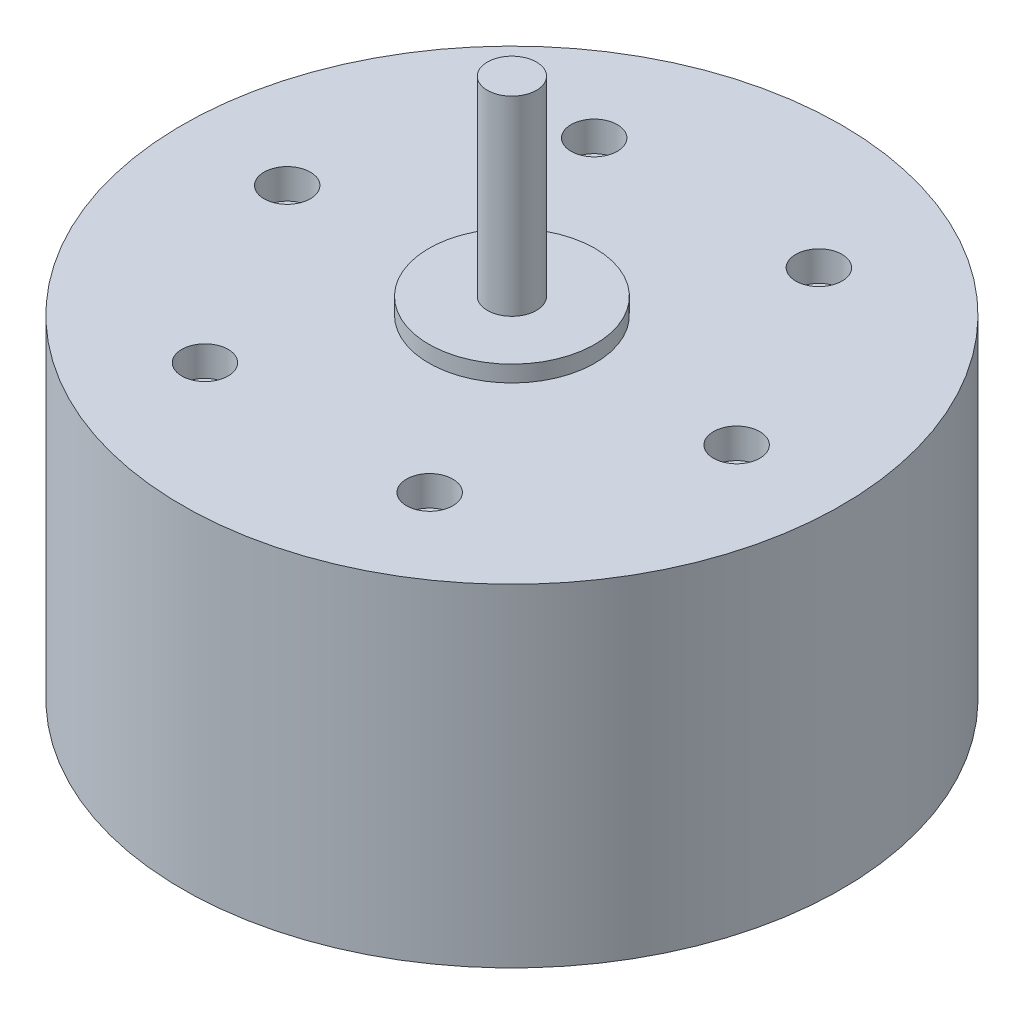
ISO-10303-21;
HEADER;
FILE_DESCRIPTION(('STEP AP214'),'2;1');
FILE_NAME('part.step','',(''),(''),'','','');
FILE_SCHEMA(('AUTOMOTIVE_DESIGN { 1 0 10303 214 1 1 1 1 }'));
ENDSEC;
DATA;
#1=APPLICATION_CONTEXT('core data for automotive mechanical design processes');
#2=APPLICATION_PROTOCOL_DEFINITION('international standard','automotive_design',2000,#1);
#3=PRODUCT_CONTEXT('',#1,'mechanical');
#4=PRODUCT('Part','Part','',(#3));
#5=PRODUCT_RELATED_PRODUCT_CATEGORY('part','',(#4));
#6=PRODUCT_DEFINITION_FORMATION('','',#4);
#7=PRODUCT_DEFINITION_CONTEXT('part definition',#1,'design');
#8=PRODUCT_DEFINITION('design','',#6,#7);
#9=PRODUCT_DEFINITION_SHAPE('','',#8);
#10=(LENGTH_UNIT() NAMED_UNIT(*) SI_UNIT(.MILLI.,.METRE.));
#11=(NAMED_UNIT(*) PLANE_ANGLE_UNIT() SI_UNIT($,.RADIAN.));
#12=(NAMED_UNIT(*) SI_UNIT($,.STERADIAN.) SOLID_ANGLE_UNIT());
#13=UNCERTAINTY_MEASURE_WITH_UNIT(LENGTH_MEASURE(1.E-05),#10,'distance_accuracy_value','');
#14=(GEOMETRIC_REPRESENTATION_CONTEXT(3) GLOBAL_UNCERTAINTY_ASSIGNED_CONTEXT((#13)) GLOBAL_UNIT_ASSIGNED_CONTEXT((#10,
#11,#12)) REPRESENTATION_CONTEXT('',''));
#15=CARTESIAN_POINT('',(0.,0.,0.));
#16=DIRECTION('',(0.,0.,1.));
#17=DIRECTION('',(1.,0.,0.));
#18=AXIS2_PLACEMENT_3D('',#15,#16,#17);
#19=CARTESIAN_POINT('',(2.85,-10.15,0.));
#20=DIRECTION('',(0.,-1.,0.));
#21=DIRECTION('',(0.,0.,-1.));
#22=AXIS2_PLACEMENT_3D('',#19,#20,#21);
#23=PLANE('',#22);
#24=CARTESIAN_POINT('',(0.,-10.15,0.));
#25=DIRECTION('',(0.,-1.,0.));
#26=DIRECTION('',(0.,0.,-1.));
#27=AXIS2_PLACEMENT_3D('',#24,#25,#26);
#28=CIRCLE('',#27,2.85);
#29=CARTESIAN_POINT('',(0.,-10.15,-2.85));
#30=VERTEX_POINT('',#29);
#31=EDGE_CURVE('E79',#30,#30,#28,.T.);
#32=ORIENTED_EDGE('',*,*,#31,.T.);
#33=EDGE_LOOP('',(#32));
#34=FACE_BOUND('',#33,.T.);
#35=ADVANCED_FACE('F36',(#34),#23,.T.);
#36=CARTESIAN_POINT('',(0.,10.15,0.));
#37=DIRECTION('',(0.,1.,0.));
#38=DIRECTION('',(0.,0.,1.));
#39=AXIS2_PLACEMENT_3D('',#36,#37,#38);
#40=PLANE('',#39);
#41=CARTESIAN_POINT('',(0.,10.15,0.));
#42=DIRECTION('',(0.,-1.,0.));
#43=DIRECTION('',(0.,0.,-1.));
#44=AXIS2_PLACEMENT_3D('',#41,#42,#43);
#45=CIRCLE('',#44,0.899999999999997);
#46=CARTESIAN_POINT('',(0.,10.15,-0.899999999999997));
#47=VERTEX_POINT('',#46);
#48=EDGE_CURVE('E10',#47,#47,#45,.T.);
#49=ORIENTED_EDGE('',*,*,#48,.F.);
#50=EDGE_LOOP('',(#49));
#51=FACE_BOUND('',#50,.T.);
#52=ADVANCED_FACE('F192',(#51),#40,.T.);
#53=CARTESIAN_POINT('',(0.,-11.8431818181818,0.));
#54=DIRECTION('',(0.,-1.,0.));
#55=DIRECTION('',(0.,0.,-1.));
#56=AXIS2_PLACEMENT_3D('',#53,#54,#55);
#57=CYLINDRICAL_SURFACE('',#56,0.899999999999998);
#58=ORIENTED_EDGE('',*,*,#48,.T.);
#59=EDGE_LOOP('',(#58));
#60=FACE_BOUND('',#59,.T.);
#61=CARTESIAN_POINT('',(0.,3.15,0.));
#62=DIRECTION('',(0.,-1.,0.));
#63=DIRECTION('',(0.,0.,-1.));
#64=AXIS2_PLACEMENT_3D('',#61,#62,#63);
#65=CIRCLE('',#64,0.899999999999998);
#66=CARTESIAN_POINT('',(0.,3.15,-0.899999999999998));
#67=VERTEX_POINT('',#66);
#68=EDGE_CURVE('E43',#67,#67,#65,.T.);
#69=ORIENTED_EDGE('',*,*,#68,.F.);
#70=EDGE_LOOP('',(#69));
#71=FACE_BOUND('',#70,.T.);
#72=ADVANCED_FACE('F196',(#60,#71),#57,.T.);
#73=CARTESIAN_POINT('',(0.899999999999998,3.15,0.));
#74=DIRECTION('',(0.,1.,0.));
#75=DIRECTION('',(0.,0.,1.));
#76=AXIS2_PLACEMENT_3D('',#73,#74,#75);
#77=PLANE('',#76);
#78=ORIENTED_EDGE('',*,*,#68,.T.);
#79=EDGE_LOOP('',(#78));
#80=FACE_BOUND('',#79,.T.);
#81=CARTESIAN_POINT('',(0.,3.15,0.));
#82=DIRECTION('',(0.,-1.,0.));
#83=DIRECTION('',(0.,0.,-1.));
#84=AXIS2_PLACEMENT_3D('',#81,#82,#83);
#85=CIRCLE('',#84,3.05);
#86=CARTESIAN_POINT('',(0.,3.15,-3.05));
#87=VERTEX_POINT('',#86);
#88=EDGE_CURVE('E48',#87,#87,#85,.T.);
#89=ORIENTED_EDGE('',*,*,#88,.F.);
#90=EDGE_LOOP('',(#89));
#91=FACE_BOUND('',#90,.T.);
#92=ADVANCED_FACE('F201',(#80,#91),#77,.T.);
#93=CARTESIAN_POINT('',(0.,-11.8431818181818,0.));
#94=DIRECTION('',(0.,-1.,0.));
#95=DIRECTION('',(0.,0.,-1.));
#96=AXIS2_PLACEMENT_3D('',#93,#94,#95);
#97=CYLINDRICAL_SURFACE('',#96,3.05);
#98=ORIENTED_EDGE('',*,*,#88,.T.);
#99=EDGE_LOOP('',(#98));
#100=FACE_BOUND('',#99,.T.);
#101=CARTESIAN_POINT('',(0.,2.55,0.));
#102=DIRECTION('',(0.,-1.,0.));
#103=DIRECTION('',(0.,0.,-1.));
#104=AXIS2_PLACEMENT_3D('',#101,#102,#103);
#105=CIRCLE('',#104,3.05);
#106=CARTESIAN_POINT('',(0.,2.55,-3.05));
#107=VERTEX_POINT('',#106);
#108=EDGE_CURVE('E53',#107,#107,#105,.T.);
#109=ORIENTED_EDGE('',*,*,#108,.F.);
#110=EDGE_LOOP('',(#109));
#111=FACE_BOUND('',#110,.T.);
#112=ADVANCED_FACE('F145',(#100,#111),#97,.T.);
#113=CARTESIAN_POINT('',(3.05,2.55,0.));
#114=DIRECTION('',(0.,1.,0.));
#115=DIRECTION('',(0.,0.,1.));
#116=AXIS2_PLACEMENT_3D('',#113,#114,#115);
#117=PLANE('',#116);
#118=CARTESIAN_POINT('',(-8.25,2.55,0.));
#119=DIRECTION('',(0.,1.,0.));
#120=DIRECTION('',(0.,0.,1.));
#121=AXIS2_PLACEMENT_3D('',#118,#119,#120);
#122=CIRCLE('',#121,0.85);
#123=CARTESIAN_POINT('',(-8.25,2.55,0.85));
#124=VERTEX_POINT('',#123);
#125=EDGE_CURVE('E117',#124,#124,#122,.T.);
#126=ORIENTED_EDGE('',*,*,#125,.F.);
#127=EDGE_LOOP('',(#126));
#128=FACE_BOUND('',#127,.T.);
#129=CARTESIAN_POINT('',(-4.12499999999999,2.55,7.14470958122162));
#130=DIRECTION('',(0.,1.,0.));
#131=DIRECTION('',(0.,0.,1.));
#132=AXIS2_PLACEMENT_3D('',#129,#130,#131);
#133=CIRCLE('',#132,0.85);
#134=CARTESIAN_POINT('',(-4.12499999999999,2.55,7.99470958122162));
#135=VERTEX_POINT('',#134);
#136=EDGE_CURVE('E118',#135,#135,#133,.T.);
#137=ORIENTED_EDGE('',*,*,#136,.F.);
#138=EDGE_LOOP('',(#137));
#139=FACE_BOUND('',#138,.T.);
#140=CARTESIAN_POINT('',(4.125,2.55,7.14470958122162));
#141=DIRECTION('',(0.,1.,0.));
#142=DIRECTION('',(0.,0.,1.));
#143=AXIS2_PLACEMENT_3D('',#140,#141,#142);
#144=CIRCLE('',#143,0.85);
#145=CARTESIAN_POINT('',(4.125,2.55,7.99470958122162));
#146=VERTEX_POINT('',#145);
#147=EDGE_CURVE('E84',#146,#146,#144,.T.);
#148=ORIENTED_EDGE('',*,*,#147,.F.);
#149=EDGE_LOOP('',(#148));
#150=FACE_BOUND('',#149,.T.);
#151=CARTESIAN_POINT('',(8.25,2.55,0.));
#152=DIRECTION('',(0.,1.,0.));
#153=DIRECTION('',(0.,0.,1.));
#154=AXIS2_PLACEMENT_3D('',#151,#152,#153);
#155=CIRCLE('',#154,0.85);
#156=CARTESIAN_POINT('',(8.25,2.55,0.85));
#157=VERTEX_POINT('',#156);
#158=EDGE_CURVE('E93',#157,#157,#155,.T.);
#159=ORIENTED_EDGE('',*,*,#158,.F.);
#160=EDGE_LOOP('',(#159));
#161=FACE_BOUND('',#160,.T.);
#162=CARTESIAN_POINT('',(4.125,2.55,-7.14470958122162));
#163=DIRECTION('',(0.,1.,0.));
#164=DIRECTION('',(0.,0.,1.));
#165=AXIS2_PLACEMENT_3D('',#162,#163,#164);
#166=CIRCLE('',#165,0.85);
#167=CARTESIAN_POINT('',(4.125,2.55,-6.29470958122162));
#168=VERTEX_POINT('',#167);
#169=EDGE_CURVE('E101',#168,#168,#166,.T.);
#170=ORIENTED_EDGE('',*,*,#169,.F.);
#171=EDGE_LOOP('',(#170));
#172=FACE_BOUND('',#171,.T.);
#173=CARTESIAN_POINT('',(-4.125,2.55,-7.14470958122162));
#174=DIRECTION('',(0.,1.,0.));
#175=DIRECTION('',(0.,0.,1.));
#176=AXIS2_PLACEMENT_3D('',#173,#174,#175);
#177=CIRCLE('',#176,0.85);
#178=CARTESIAN_POINT('',(-4.125,2.55,-6.29470958122162));
#179=VERTEX_POINT('',#178);
#180=EDGE_CURVE('E109',#179,#179,#177,.T.);
#181=ORIENTED_EDGE('',*,*,#180,.F.);
#182=EDGE_LOOP('',(#181));
#183=FACE_BOUND('',#182,.T.);
#184=ORIENTED_EDGE('',*,*,#108,.T.);
#185=EDGE_LOOP('',(#184));
#186=FACE_BOUND('',#185,.T.);
#187=CARTESIAN_POINT('',(0.,2.55,0.));
#188=DIRECTION('',(0.,-1.,0.));
#189=DIRECTION('',(0.,0.,-1.));
#190=AXIS2_PLACEMENT_3D('',#187,#188,#189);
#191=CIRCLE('',#190,12.1);
#192=CARTESIAN_POINT('',(0.,2.55,-12.1));
#193=VERTEX_POINT('',#192);
#194=EDGE_CURVE('E59',#193,#193,#191,.T.);
#195=ORIENTED_EDGE('',*,*,#194,.F.);
#196=EDGE_LOOP('',(#195));
#197=FACE_BOUND('',#196,.T.);
#198=ADVANCED_FACE('F141',(#128,#139,#150,#161,#172,#183,#186,#197),#117,.T.);
#199=CARTESIAN_POINT('',(0.,-11.8431818181818,0.));
#200=DIRECTION('',(0.,-1.,0.));
#201=DIRECTION('',(0.,0.,-1.));
#202=AXIS2_PLACEMENT_3D('',#199,#200,#201);
#203=CYLINDRICAL_SURFACE('',#202,12.1);
#204=ORIENTED_EDGE('',*,*,#194,.T.);
#205=EDGE_LOOP('',(#204));
#206=FACE_BOUND('',#205,.T.);
#207=CARTESIAN_POINT('',(0.,-9.65,0.));
#208=DIRECTION('',(0.,-1.,0.));
#209=DIRECTION('',(0.,0.,-1.));
#210=AXIS2_PLACEMENT_3D('',#207,#208,#209);
#211=CIRCLE('',#210,12.1);
#212=CARTESIAN_POINT('',(0.,-9.65,-12.1));
#213=VERTEX_POINT('',#212);
#214=EDGE_CURVE('E63',#213,#213,#211,.T.);
#215=ORIENTED_EDGE('',*,*,#214,.F.);
#216=EDGE_LOOP('',(#215));
#217=FACE_BOUND('',#216,.T.);
#218=ADVANCED_FACE('F144',(#206,#217),#203,.T.);
#219=CARTESIAN_POINT('',(12.1,-9.65,0.));
#220=DIRECTION('',(0.,-1.,0.));
#221=DIRECTION('',(0.,0.,-1.));
#222=AXIS2_PLACEMENT_3D('',#219,#220,#221);
#223=PLANE('',#222);
#224=ORIENTED_EDGE('',*,*,#214,.T.);
#225=EDGE_LOOP('',(#224));
#226=FACE_BOUND('',#225,.T.);
#227=CARTESIAN_POINT('',(0.,-9.65,0.));
#228=DIRECTION('',(0.,-1.,0.));
#229=DIRECTION('',(0.,0.,-1.));
#230=AXIS2_PLACEMENT_3D('',#227,#228,#229);
#231=CIRCLE('',#230,11.9);
#232=CARTESIAN_POINT('',(0.,-9.65,-11.9));
#233=VERTEX_POINT('',#232);
#234=EDGE_CURVE('E67',#233,#233,#231,.T.);
#235=ORIENTED_EDGE('',*,*,#234,.F.);
#236=EDGE_LOOP('',(#235));
#237=FACE_BOUND('',#236,.T.);
#238=ADVANCED_FACE('F163',(#226,#237),#223,.T.);
#239=CARTESIAN_POINT('',(0.,-11.8431818181818,0.));
#240=DIRECTION('',(0.,-1.,0.));
#241=DIRECTION('',(0.,0.,-1.));
#242=AXIS2_PLACEMENT_3D('',#239,#240,#241);
#243=CYLINDRICAL_SURFACE('',#242,11.9);
#244=ORIENTED_EDGE('',*,*,#234,.T.);
#245=EDGE_LOOP('',(#244));
#246=FACE_BOUND('',#245,.T.);
#247=CARTESIAN_POINT('',(0.,-9.05,0.));
#248=DIRECTION('',(0.,-1.,0.));
#249=DIRECTION('',(0.,0.,-1.));
#250=AXIS2_PLACEMENT_3D('',#247,#248,#249);
#251=CIRCLE('',#250,11.9);
#252=CARTESIAN_POINT('',(0.,-9.05,-11.9));
#253=VERTEX_POINT('',#252);
#254=EDGE_CURVE('E71',#253,#253,#251,.T.);
#255=ORIENTED_EDGE('',*,*,#254,.F.);
#256=EDGE_LOOP('',(#255));
#257=FACE_BOUND('',#256,.T.);
#258=ADVANCED_FACE('F169',(#246,#257),#243,.F.);
#259=CARTESIAN_POINT('',(11.9,-9.05,0.));
#260=DIRECTION('',(0.,-1.,0.));
#261=DIRECTION('',(0.,0.,-1.));
#262=AXIS2_PLACEMENT_3D('',#259,#260,#261);
#263=PLANE('',#262);
#264=ORIENTED_EDGE('',*,*,#254,.T.);
#265=EDGE_LOOP('',(#264));
#266=FACE_BOUND('',#265,.T.);
#267=CARTESIAN_POINT('',(0.,-9.05,0.));
#268=DIRECTION('',(0.,-1.,0.));
#269=DIRECTION('',(0.,0.,-1.));
#270=AXIS2_PLACEMENT_3D('',#267,#268,#269);
#271=CIRCLE('',#270,2.85);
#272=CARTESIAN_POINT('',(0.,-9.05,-2.85));
#273=VERTEX_POINT('',#272);
#274=EDGE_CURVE('E75',#273,#273,#271,.T.);
#275=ORIENTED_EDGE('',*,*,#274,.F.);
#276=EDGE_LOOP('',(#275));
#277=FACE_BOUND('',#276,.T.);
#278=ADVANCED_FACE('F175',(#266,#277),#263,.T.);
#279=CARTESIAN_POINT('',(0.,-11.8431818181818,0.));
#280=DIRECTION('',(0.,-1.,0.));
#281=DIRECTION('',(0.,0.,-1.));
#282=AXIS2_PLACEMENT_3D('',#279,#280,#281);
#283=CYLINDRICAL_SURFACE('',#282,2.85);
#284=ORIENTED_EDGE('',*,*,#274,.T.);
#285=EDGE_LOOP('',(#284));
#286=FACE_BOUND('',#285,.T.);
#287=ORIENTED_EDGE('',*,*,#31,.F.);
#288=EDGE_LOOP('',(#287));
#289=FACE_BOUND('',#288,.T.);
#290=ADVANCED_FACE('F181',(#286,#289),#283,.T.);
#291=CARTESIAN_POINT('',(-4.125,1.45,-7.14470958122162));
#292=DIRECTION('',(0.,1.,0.));
#293=DIRECTION('',(0.,0.,1.));
#294=AXIS2_PLACEMENT_3D('',#291,#292,#293);
#295=CYLINDRICAL_SURFACE('',#294,0.85);
#296=CARTESIAN_POINT('',(-4.125,1.45,-7.14470958122162));
#297=DIRECTION('',(0.,1.,0.));
#298=DIRECTION('',(0.,0.,1.));
#299=AXIS2_PLACEMENT_3D('',#296,#297,#298);
#300=CIRCLE('',#299,0.85);
#301=CARTESIAN_POINT('',(-4.125,1.45,-6.29470958122162));
#302=VERTEX_POINT('',#301);
#303=EDGE_CURVE('E113',#302,#302,#300,.T.);
#304=ORIENTED_EDGE('',*,*,#303,.F.);
#305=EDGE_LOOP('',(#304));
#306=FACE_BOUND('',#305,.T.);
#307=ORIENTED_EDGE('',*,*,#180,.T.);
#308=EDGE_LOOP('',(#307));
#309=FACE_BOUND('',#308,.T.);
#310=ADVANCED_FACE('F187',(#306,#309),#295,.F.);
#311=CARTESIAN_POINT('',(-4.125,1.45,-7.14470958122162));
#312=DIRECTION('',(0.,1.,0.));
#313=DIRECTION('',(0.,0.,1.));
#314=AXIS2_PLACEMENT_3D('',#311,#312,#313);
#315=PLANE('',#314);
#316=ORIENTED_EDGE('',*,*,#303,.T.);
#317=EDGE_LOOP('',(#316));
#318=FACE_BOUND('',#317,.T.);
#319=ADVANCED_FACE('F230',(#318),#315,.T.);
#320=CARTESIAN_POINT('',(4.125,1.45,-7.14470958122162));
#321=DIRECTION('',(0.,1.,0.));
#322=DIRECTION('',(0.,0.,1.));
#323=AXIS2_PLACEMENT_3D('',#320,#321,#322);
#324=CYLINDRICAL_SURFACE('',#323,0.85);
#325=CARTESIAN_POINT('',(4.125,1.45,-7.14470958122162));
#326=DIRECTION('',(0.,1.,0.));
#327=DIRECTION('',(0.,0.,1.));
#328=AXIS2_PLACEMENT_3D('',#325,#326,#327);
#329=CIRCLE('',#328,0.85);
#330=CARTESIAN_POINT('',(4.125,1.45,-6.29470958122162));
#331=VERTEX_POINT('',#330);
#332=EDGE_CURVE('E105',#331,#331,#329,.T.);
#333=ORIENTED_EDGE('',*,*,#332,.F.);
#334=EDGE_LOOP('',(#333));
#335=FACE_BOUND('',#334,.T.);
#336=ORIENTED_EDGE('',*,*,#169,.T.);
#337=EDGE_LOOP('',(#336));
#338=FACE_BOUND('',#337,.T.);
#339=ADVANCED_FACE('F227',(#335,#338),#324,.F.);
#340=CARTESIAN_POINT('',(4.125,1.45,-7.14470958122162));
#341=DIRECTION('',(0.,1.,0.));
#342=DIRECTION('',(0.,0.,1.));
#343=AXIS2_PLACEMENT_3D('',#340,#341,#342);
#344=PLANE('',#343);
#345=ORIENTED_EDGE('',*,*,#332,.T.);
#346=EDGE_LOOP('',(#345));
#347=FACE_BOUND('',#346,.T.);
#348=ADVANCED_FACE('F222',(#347),#344,.T.);
#349=CARTESIAN_POINT('',(8.25,1.45,0.));
#350=DIRECTION('',(0.,1.,0.));
#351=DIRECTION('',(0.,0.,1.));
#352=AXIS2_PLACEMENT_3D('',#349,#350,#351);
#353=CYLINDRICAL_SURFACE('',#352,0.85);
#354=CARTESIAN_POINT('',(8.25,1.45,0.));
#355=DIRECTION('',(0.,1.,0.));
#356=DIRECTION('',(0.,0.,1.));
#357=AXIS2_PLACEMENT_3D('',#354,#355,#356);
#358=CIRCLE('',#357,0.85);
#359=CARTESIAN_POINT('',(8.25,1.45,0.85));
#360=VERTEX_POINT('',#359);
#361=EDGE_CURVE('E97',#360,#360,#358,.T.);
#362=ORIENTED_EDGE('',*,*,#361,.F.);
#363=EDGE_LOOP('',(#362));
#364=FACE_BOUND('',#363,.T.);
#365=ORIENTED_EDGE('',*,*,#158,.T.);
#366=EDGE_LOOP('',(#365));
#367=FACE_BOUND('',#366,.T.);
#368=ADVANCED_FACE('F219',(#364,#367),#353,.F.);
#369=CARTESIAN_POINT('',(8.25,1.45,0.));
#370=DIRECTION('',(0.,1.,0.));
#371=DIRECTION('',(0.,0.,1.));
#372=AXIS2_PLACEMENT_3D('',#369,#370,#371);
#373=PLANE('',#372);
#374=ORIENTED_EDGE('',*,*,#361,.T.);
#375=EDGE_LOOP('',(#374));
#376=FACE_BOUND('',#375,.T.);
#377=ADVANCED_FACE('F213',(#376),#373,.T.);
#378=CARTESIAN_POINT('',(4.125,1.45,7.14470958122162));
#379=DIRECTION('',(0.,1.,0.));
#380=DIRECTION('',(0.,0.,1.));
#381=AXIS2_PLACEMENT_3D('',#378,#379,#380);
#382=CYLINDRICAL_SURFACE('',#381,0.85);
#383=CARTESIAN_POINT('',(4.125,1.45,7.14470958122162));
#384=DIRECTION('',(0.,1.,0.));
#385=DIRECTION('',(0.,0.,1.));
#386=AXIS2_PLACEMENT_3D('',#383,#384,#385);
#387=CIRCLE('',#386,0.85);
#388=CARTESIAN_POINT('',(4.125,1.45,7.99470958122162));
#389=VERTEX_POINT('',#388);
#390=EDGE_CURVE('E88',#389,#389,#387,.T.);
#391=ORIENTED_EDGE('',*,*,#390,.F.);
#392=EDGE_LOOP('',(#391));
#393=FACE_BOUND('',#392,.T.);
#394=ORIENTED_EDGE('',*,*,#147,.T.);
#395=EDGE_LOOP('',(#394));
#396=FACE_BOUND('',#395,.T.);
#397=ADVANCED_FACE('F209',(#393,#396),#382,.F.);
#398=CARTESIAN_POINT('',(4.125,1.45,7.14470958122162));
#399=DIRECTION('',(0.,1.,0.));
#400=DIRECTION('',(0.,0.,1.));
#401=AXIS2_PLACEMENT_3D('',#398,#399,#400);
#402=PLANE('',#401);
#403=ORIENTED_EDGE('',*,*,#390,.T.);
#404=EDGE_LOOP('',(#403));
#405=FACE_BOUND('',#404,.T.);
#406=ADVANCED_FACE('F212',(#405),#402,.T.);
#407=CARTESIAN_POINT('',(-4.12499999999999,1.45,7.14470958122162));
#408=DIRECTION('',(0.,1.,0.));
#409=DIRECTION('',(0.,0.,1.));
#410=AXIS2_PLACEMENT_3D('',#407,#408,#409);
#411=CYLINDRICAL_SURFACE('',#410,0.85);
#412=CARTESIAN_POINT('',(-4.12499999999999,1.45,7.14470958122162));
#413=DIRECTION('',(0.,1.,0.));
#414=DIRECTION('',(0.,0.,1.));
#415=AXIS2_PLACEMENT_3D('',#412,#413,#414);
#416=CIRCLE('',#415,0.85);
#417=CARTESIAN_POINT('',(-4.12499999999999,1.45,7.99470958122162));
#418=VERTEX_POINT('',#417);
#419=EDGE_CURVE('E89',#418,#418,#416,.T.);
#420=ORIENTED_EDGE('',*,*,#419,.F.);
#421=EDGE_LOOP('',(#420));
#422=FACE_BOUND('',#421,.T.);
#423=ORIENTED_EDGE('',*,*,#136,.T.);
#424=EDGE_LOOP('',(#423));
#425=FACE_BOUND('',#424,.T.);
#426=ADVANCED_FACE('F217',(#422,#425),#411,.F.);
#427=CARTESIAN_POINT('',(-4.12499999999999,1.45,7.14470958122162));
#428=DIRECTION('',(0.,1.,0.));
#429=DIRECTION('',(0.,0.,1.));
#430=AXIS2_PLACEMENT_3D('',#427,#428,#429);
#431=PLANE('',#430);
#432=ORIENTED_EDGE('',*,*,#419,.T.);
#433=EDGE_LOOP('',(#432));
#434=FACE_BOUND('',#433,.T.);
#435=ADVANCED_FACE('F137',(#434),#431,.T.);
#436=CARTESIAN_POINT('',(-8.25,1.45,0.));
#437=DIRECTION('',(0.,1.,0.));
#438=DIRECTION('',(0.,0.,1.));
#439=AXIS2_PLACEMENT_3D('',#436,#437,#438);
#440=CYLINDRICAL_SURFACE('',#439,0.85);
#441=CARTESIAN_POINT('',(-8.25,1.45,0.));
#442=DIRECTION('',(0.,1.,0.));
#443=DIRECTION('',(0.,0.,1.));
#444=AXIS2_PLACEMENT_3D('',#441,#442,#443);
#445=CIRCLE('',#444,0.85);
#446=CARTESIAN_POINT('',(-8.25,1.45,0.85));
#447=VERTEX_POINT('',#446);
#448=EDGE_CURVE('E83',#447,#447,#445,.T.);
#449=ORIENTED_EDGE('',*,*,#448,.F.);
#450=EDGE_LOOP('',(#449));
#451=FACE_BOUND('',#450,.T.);
#452=ORIENTED_EDGE('',*,*,#125,.T.);
#453=EDGE_LOOP('',(#452));
#454=FACE_BOUND('',#453,.T.);
#455=ADVANCED_FACE('F134',(#451,#454),#440,.F.);
#456=CARTESIAN_POINT('',(-8.25,1.45,0.));
#457=DIRECTION('',(0.,1.,0.));
#458=DIRECTION('',(0.,0.,1.));
#459=AXIS2_PLACEMENT_3D('',#456,#457,#458);
#460=PLANE('',#459);
#461=ORIENTED_EDGE('',*,*,#448,.T.);
#462=EDGE_LOOP('',(#461));
#463=FACE_BOUND('',#462,.T.);
#464=ADVANCED_FACE('F132',(#463),#460,.T.);
#465=CLOSED_SHELL('',(#35,#52,#72,#92,#112,#198,#218,#238,#258,#278,#290,#310,#319,#339,#348,
#368,#377,#397,#406,#426,#435,#455,#464));
#466=MANIFOLD_SOLID_BREP('B2',#465);
#467=ADVANCED_BREP_SHAPE_REPRESENTATION('',(#18,#466),#14);
#468=SHAPE_DEFINITION_REPRESENTATION(#9,#467);
ENDSEC;
END-ISO-10303-21;
